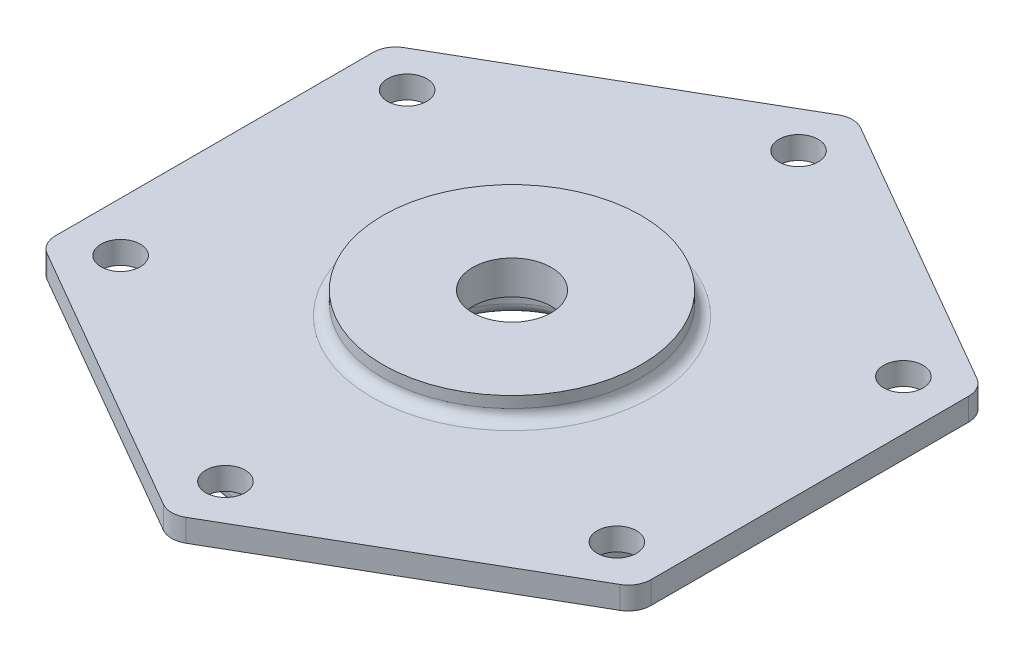
ISO-10303-21;
HEADER;
FILE_DESCRIPTION(('STEP AP214'),'2;1');
FILE_NAME('part.step','',(''),(''),'','','');
FILE_SCHEMA(('AUTOMOTIVE_DESIGN { 1 0 10303 214 1 1 1 1 }'));
ENDSEC;
DATA;
#1=APPLICATION_CONTEXT('core data for automotive mechanical design processes');
#2=APPLICATION_PROTOCOL_DEFINITION('international standard','automotive_design',2000,#1);
#3=PRODUCT_CONTEXT('',#1,'mechanical');
#4=PRODUCT('Part','Part','',(#3));
#5=PRODUCT_RELATED_PRODUCT_CATEGORY('part','',(#4));
#6=PRODUCT_DEFINITION_FORMATION('','',#4);
#7=PRODUCT_DEFINITION_CONTEXT('part definition',#1,'design');
#8=PRODUCT_DEFINITION('design','',#6,#7);
#9=PRODUCT_DEFINITION_SHAPE('','',#8);
#10=(LENGTH_UNIT() NAMED_UNIT(*) SI_UNIT(.MILLI.,.METRE.));
#11=(NAMED_UNIT(*) PLANE_ANGLE_UNIT() SI_UNIT($,.RADIAN.));
#12=(NAMED_UNIT(*) SI_UNIT($,.STERADIAN.) SOLID_ANGLE_UNIT());
#13=UNCERTAINTY_MEASURE_WITH_UNIT(LENGTH_MEASURE(1.E-05),#10,'distance_accuracy_value','');
#14=(GEOMETRIC_REPRESENTATION_CONTEXT(3) GLOBAL_UNCERTAINTY_ASSIGNED_CONTEXT((#13)) GLOBAL_UNIT_ASSIGNED_CONTEXT((#10,
#11,#12)) REPRESENTATION_CONTEXT('',''));
#15=CARTESIAN_POINT('',(0.,0.,0.));
#16=DIRECTION('',(0.,0.,1.));
#17=DIRECTION('',(1.,0.,0.));
#18=AXIS2_PLACEMENT_3D('',#15,#16,#17);
#19=CARTESIAN_POINT('',(-48.9999999999997,4.,28.2901631902923));
#20=DIRECTION('',(0.,-1.,0.));
#21=DIRECTION('',(0.,0.,-1.));
#22=AXIS2_PLACEMENT_3D('',#19,#20,#21);
#23=CYLINDRICAL_SURFACE('',#22,4.);
#24=CARTESIAN_POINT('',(-48.9999999999997,0.,28.2901631902923));
#25=DIRECTION('',(0.,1.,0.));
#26=DIRECTION('',(0.,0.,1.));
#27=AXIS2_PLACEMENT_3D('',#24,#25,#26);
#28=CIRCLE('',#27,4.);
#29=CARTESIAN_POINT('',(-52.9999999999997,0.,28.2901631902923));
#30=VERTEX_POINT('',#29);
#31=CARTESIAN_POINT('',(-50.9999999999997,0.,31.75426480543));
#32=VERTEX_POINT('',#31);
#33=EDGE_CURVE('E157',#30,#32,#28,.T.);
#34=ORIENTED_EDGE('',*,*,#33,.T.);
#35=DIRECTION('',(0.,-1.,0.));
#36=VECTOR('',#35,1.);
#37=CARTESIAN_POINT('',(-50.9999999999997,4.,31.75426480543));
#38=LINE('',#37,#36);
#39=CARTESIAN_POINT('',(-50.9999999999997,4.,31.75426480543));
#40=VERTEX_POINT('',#39);
#41=EDGE_CURVE('E205',#40,#32,#38,.T.);
#42=ORIENTED_EDGE('',*,*,#41,.F.);
#43=CARTESIAN_POINT('',(-48.9999999999997,4.,28.2901631902923));
#44=DIRECTION('',(0.,1.,0.));
#45=DIRECTION('',(0.,0.,1.));
#46=AXIS2_PLACEMENT_3D('',#43,#44,#45);
#47=CIRCLE('',#46,4.);
#48=CARTESIAN_POINT('',(-52.9999999999997,4.,28.2901631902923));
#49=VERTEX_POINT('',#48);
#50=EDGE_CURVE('E180',#49,#40,#47,.T.);
#51=ORIENTED_EDGE('',*,*,#50,.F.);
#52=DIRECTION('',(0.,-1.,0.));
#53=VECTOR('',#52,1.);
#54=CARTESIAN_POINT('',(-52.9999999999997,4.,28.2901631902923));
#55=LINE('',#54,#53);
#56=EDGE_CURVE('E153',#49,#30,#55,.T.);
#57=ORIENTED_EDGE('',*,*,#56,.T.);
#58=EDGE_LOOP('',(#34,#42,#51,#57));
#59=FACE_BOUND('',#58,.T.);
#60=ADVANCED_FACE('F33',(#59),#23,.T.);
#61=CARTESIAN_POINT('',(-50.9999999999997,4.,31.75426480543));
#62=DIRECTION('',(0.499999999999995,0.,-0.866025403784442));
#63=DIRECTION('',(-0.866025403784442,0.,-0.499999999999995));
#64=AXIS2_PLACEMENT_3D('',#61,#62,#63);
#65=PLANE('',#64);
#66=DIRECTION('',(0.866025403784441,0.,0.499999999999995));
#67=VECTOR('',#66,1.);
#68=CARTESIAN_POINT('',(-50.9999999999997,0.,31.75426480543));
#69=LINE('',#68,#67);
#70=CARTESIAN_POINT('',(-2.00000000000001,0.,60.0444279957211));
#71=VERTEX_POINT('',#70);
#72=EDGE_CURVE('E160',#32,#71,#69,.T.);
#73=ORIENTED_EDGE('',*,*,#72,.T.);
#74=DIRECTION('',(0.,-1.,0.));
#75=VECTOR('',#74,1.);
#76=CARTESIAN_POINT('',(-2.00000000000001,4.,60.0444279957211));
#77=LINE('',#76,#75);
#78=CARTESIAN_POINT('',(-2.00000000000001,4.,60.0444279957211));
#79=VERTEX_POINT('',#78);
#80=EDGE_CURVE('E202',#79,#71,#77,.T.);
#81=ORIENTED_EDGE('',*,*,#80,.F.);
#82=DIRECTION('',(0.866025403784441,0.,0.499999999999995));
#83=VECTOR('',#82,1.);
#84=CARTESIAN_POINT('',(-50.9999999999997,4.,31.75426480543));
#85=LINE('',#84,#83);
#86=EDGE_CURVE('E108',#40,#79,#85,.T.);
#87=ORIENTED_EDGE('',*,*,#86,.F.);
#88=ORIENTED_EDGE('',*,*,#41,.T.);
#89=EDGE_LOOP('',(#73,#81,#87,#88));
#90=FACE_BOUND('',#89,.T.);
#91=ADVANCED_FACE('F318',(#90),#65,.F.);
#92=CARTESIAN_POINT('',(0.,4.,56.5803263805834));
#93=DIRECTION('',(0.,-1.,0.));
#94=DIRECTION('',(0.,0.,-1.));
#95=AXIS2_PLACEMENT_3D('',#92,#93,#94);
#96=CYLINDRICAL_SURFACE('',#95,4.);
#97=CARTESIAN_POINT('',(0.,0.,56.5803263805834));
#98=DIRECTION('',(0.,1.,0.));
#99=DIRECTION('',(0.,0.,-1.));
#100=AXIS2_PLACEMENT_3D('',#97,#98,#99);
#101=CIRCLE('',#100,4.);
#102=CARTESIAN_POINT('',(2.,0.,60.0444279957211));
#103=VERTEX_POINT('',#102);
#104=EDGE_CURVE('E163',#71,#103,#101,.T.);
#105=ORIENTED_EDGE('',*,*,#104,.T.);
#106=DIRECTION('',(0.,-1.,0.));
#107=VECTOR('',#106,1.);
#108=CARTESIAN_POINT('',(2.,4.,60.0444279957211));
#109=LINE('',#108,#107);
#110=CARTESIAN_POINT('',(2.,4.,60.0444279957211));
#111=VERTEX_POINT('',#110);
#112=EDGE_CURVE('E199',#111,#103,#109,.T.);
#113=ORIENTED_EDGE('',*,*,#112,.F.);
#114=CARTESIAN_POINT('',(0.,4.,56.5803263805834));
#115=DIRECTION('',(0.,1.,0.));
#116=DIRECTION('',(0.,0.,-1.));
#117=AXIS2_PLACEMENT_3D('',#114,#115,#116);
#118=CIRCLE('',#117,4.);
#119=EDGE_CURVE('E278',#79,#111,#118,.T.);
#120=ORIENTED_EDGE('',*,*,#119,.F.);
#121=ORIENTED_EDGE('',*,*,#80,.T.);
#122=EDGE_LOOP('',(#105,#113,#120,#121));
#123=FACE_BOUND('',#122,.T.);
#124=ADVANCED_FACE('F323',(#123),#96,.T.);
#125=CARTESIAN_POINT('',(2.,4.,60.0444279957211));
#126=DIRECTION('',(-0.500000000000001,0.,-0.866025403784438));
#127=DIRECTION('',(-0.866025403784438,0.,0.500000000000001));
#128=AXIS2_PLACEMENT_3D('',#125,#126,#127);
#129=PLANE('',#128);
#130=DIRECTION('',(0.866025403784438,0.,-0.500000000000001));
#131=VECTOR('',#130,1.);
#132=CARTESIAN_POINT('',(2.,0.,60.0444279957211));
#133=LINE('',#132,#131);
#134=CARTESIAN_POINT('',(51.0000000000001,0.,31.7542648054293));
#135=VERTEX_POINT('',#134);
#136=EDGE_CURVE('E165',#103,#135,#133,.T.);
#137=ORIENTED_EDGE('',*,*,#136,.T.);
#138=DIRECTION('',(0.,-1.,0.));
#139=VECTOR('',#138,1.);
#140=CARTESIAN_POINT('',(51.0000000000001,4.,31.7542648054293));
#141=LINE('',#140,#139);
#142=CARTESIAN_POINT('',(51.0000000000001,4.,31.7542648054293));
#143=VERTEX_POINT('',#142);
#144=EDGE_CURVE('E196',#143,#135,#141,.T.);
#145=ORIENTED_EDGE('',*,*,#144,.F.);
#146=DIRECTION('',(0.866025403784438,0.,-0.500000000000001));
#147=VECTOR('',#146,1.);
#148=CARTESIAN_POINT('',(2.,4.,60.0444279957211));
#149=LINE('',#148,#147);
#150=EDGE_CURVE('E280',#111,#143,#149,.T.);
#151=ORIENTED_EDGE('',*,*,#150,.F.);
#152=ORIENTED_EDGE('',*,*,#112,.T.);
#153=EDGE_LOOP('',(#137,#145,#151,#152));
#154=FACE_BOUND('',#153,.T.);
#155=ADVANCED_FACE('F670',(#154),#129,.F.);
#156=CARTESIAN_POINT('',(49.0000000000001,4.,28.2901631902916));
#157=DIRECTION('',(0.,-1.,0.));
#158=DIRECTION('',(0.,0.,-1.));
#159=AXIS2_PLACEMENT_3D('',#156,#157,#158);
#160=CYLINDRICAL_SURFACE('',#159,4.);
#161=CARTESIAN_POINT('',(49.0000000000001,0.,28.2901631902916));
#162=DIRECTION('',(0.,1.,0.));
#163=DIRECTION('',(0.,0.,1.));
#164=AXIS2_PLACEMENT_3D('',#161,#162,#163);
#165=CIRCLE('',#164,4.);
#166=CARTESIAN_POINT('',(53.0000000000001,0.,28.2901631902915));
#167=VERTEX_POINT('',#166);
#168=EDGE_CURVE('E167',#135,#167,#165,.T.);
#169=ORIENTED_EDGE('',*,*,#168,.T.);
#170=DIRECTION('',(0.,-1.,0.));
#171=VECTOR('',#170,1.);
#172=CARTESIAN_POINT('',(53.0000000000001,4.,28.2901631902915));
#173=LINE('',#172,#171);
#174=CARTESIAN_POINT('',(53.0000000000001,4.,28.2901631902915));
#175=VERTEX_POINT('',#174);
#176=EDGE_CURVE('E193',#175,#167,#173,.T.);
#177=ORIENTED_EDGE('',*,*,#176,.F.);
#178=CARTESIAN_POINT('',(49.0000000000001,4.,28.2901631902916));
#179=DIRECTION('',(0.,1.,0.));
#180=DIRECTION('',(0.,0.,1.));
#181=AXIS2_PLACEMENT_3D('',#178,#179,#180);
#182=CIRCLE('',#181,4.);
#183=EDGE_CURVE('E282',#143,#175,#182,.T.);
#184=ORIENTED_EDGE('',*,*,#183,.F.);
#185=ORIENTED_EDGE('',*,*,#144,.T.);
#186=EDGE_LOOP('',(#169,#177,#184,#185));
#187=FACE_BOUND('',#186,.T.);
#188=ADVANCED_FACE('F660',(#187),#160,.T.);
#189=CARTESIAN_POINT('',(53.0000000000001,4.,28.2901631902915));
#190=DIRECTION('',(-1.,0.,0.));
#191=DIRECTION('',(0.,0.,1.));
#192=AXIS2_PLACEMENT_3D('',#189,#190,#191);
#193=PLANE('',#192);
#194=DIRECTION('',(0.,0.,-1.));
#195=VECTOR('',#194,1.);
#196=CARTESIAN_POINT('',(53.0000000000001,0.,28.2901631902915));
#197=LINE('',#196,#195);
#198=CARTESIAN_POINT('',(52.9999999999999,0.,-28.2901631902919));
#199=VERTEX_POINT('',#198);
#200=EDGE_CURVE('E169',#167,#199,#197,.T.);
#201=ORIENTED_EDGE('',*,*,#200,.T.);
#202=DIRECTION('',(0.,-1.,0.));
#203=VECTOR('',#202,1.);
#204=CARTESIAN_POINT('',(52.9999999999999,4.,-28.2901631902919));
#205=LINE('',#204,#203);
#206=CARTESIAN_POINT('',(52.9999999999999,4.,-28.2901631902919));
#207=VERTEX_POINT('',#206);
#208=EDGE_CURVE('E190',#207,#199,#205,.T.);
#209=ORIENTED_EDGE('',*,*,#208,.F.);
#210=DIRECTION('',(0.,0.,-1.));
#211=VECTOR('',#210,1.);
#212=CARTESIAN_POINT('',(53.0000000000001,4.,28.2901631902915));
#213=LINE('',#212,#211);
#214=EDGE_CURVE('E284',#175,#207,#213,.T.);
#215=ORIENTED_EDGE('',*,*,#214,.F.);
#216=ORIENTED_EDGE('',*,*,#176,.T.);
#217=EDGE_LOOP('',(#201,#209,#215,#216));
#218=FACE_BOUND('',#217,.T.);
#219=ADVANCED_FACE('F650',(#218),#193,.F.);
#220=CARTESIAN_POINT('',(48.9999999999999,4.,-28.2901631902919));
#221=DIRECTION('',(0.,-1.,0.));
#222=DIRECTION('',(0.,0.,-1.));
#223=AXIS2_PLACEMENT_3D('',#220,#221,#222);
#224=CYLINDRICAL_SURFACE('',#223,4.);
#225=CARTESIAN_POINT('',(48.9999999999999,0.,-28.2901631902919));
#226=DIRECTION('',(0.,1.,0.));
#227=DIRECTION('',(0.,0.,1.));
#228=AXIS2_PLACEMENT_3D('',#225,#226,#227);
#229=CIRCLE('',#228,4.);
#230=CARTESIAN_POINT('',(50.9999999999999,0.,-31.7542648054297));
#231=VERTEX_POINT('',#230);
#232=EDGE_CURVE('E171',#199,#231,#229,.T.);
#233=ORIENTED_EDGE('',*,*,#232,.T.);
#234=DIRECTION('',(0.,-1.,0.));
#235=VECTOR('',#234,1.);
#236=CARTESIAN_POINT('',(50.9999999999999,4.,-31.7542648054297));
#237=LINE('',#236,#235);
#238=CARTESIAN_POINT('',(50.9999999999999,4.,-31.7542648054297));
#239=VERTEX_POINT('',#238);
#240=EDGE_CURVE('E187',#239,#231,#237,.T.);
#241=ORIENTED_EDGE('',*,*,#240,.F.);
#242=CARTESIAN_POINT('',(48.9999999999999,4.,-28.2901631902919));
#243=DIRECTION('',(0.,1.,0.));
#244=DIRECTION('',(0.,0.,1.));
#245=AXIS2_PLACEMENT_3D('',#242,#243,#244);
#246=CIRCLE('',#245,4.);
#247=EDGE_CURVE('E286',#207,#239,#246,.T.);
#248=ORIENTED_EDGE('',*,*,#247,.F.);
#249=ORIENTED_EDGE('',*,*,#208,.T.);
#250=EDGE_LOOP('',(#233,#241,#248,#249));
#251=FACE_BOUND('',#250,.T.);
#252=ADVANCED_FACE('F641',(#251),#224,.T.);
#253=CARTESIAN_POINT('',(50.9999999999999,4.,-31.7542648054297));
#254=DIRECTION('',(-0.499999999999995,0.,0.866025403784442));
#255=DIRECTION('',(0.866025403784442,0.,0.499999999999995));
#256=AXIS2_PLACEMENT_3D('',#253,#254,#255);
#257=PLANE('',#256);
#258=DIRECTION('',(-0.866025403784442,0.,-0.499999999999995));
#259=VECTOR('',#258,1.);
#260=CARTESIAN_POINT('',(50.9999999999999,0.,-31.7542648054297));
#261=LINE('',#260,#259);
#262=CARTESIAN_POINT('',(1.9999999999996,0.,-60.0444279957211));
#263=VERTEX_POINT('',#262);
#264=EDGE_CURVE('E173',#231,#263,#261,.T.);
#265=ORIENTED_EDGE('',*,*,#264,.T.);
#266=DIRECTION('',(0.,-1.,0.));
#267=VECTOR('',#266,1.);
#268=CARTESIAN_POINT('',(1.9999999999996,4.,-60.0444279957211));
#269=LINE('',#268,#267);
#270=CARTESIAN_POINT('',(1.9999999999996,4.,-60.0444279957211));
#271=VERTEX_POINT('',#270);
#272=EDGE_CURVE('E184',#271,#263,#269,.T.);
#273=ORIENTED_EDGE('',*,*,#272,.F.);
#274=DIRECTION('',(-0.866025403784442,0.,-0.499999999999995));
#275=VECTOR('',#274,1.);
#276=CARTESIAN_POINT('',(50.9999999999999,4.,-31.7542648054297));
#277=LINE('',#276,#275);
#278=EDGE_CURVE('E288',#239,#271,#277,.T.);
#279=ORIENTED_EDGE('',*,*,#278,.F.);
#280=ORIENTED_EDGE('',*,*,#240,.T.);
#281=EDGE_LOOP('',(#265,#273,#279,#280));
#282=FACE_BOUND('',#281,.T.);
#283=ADVANCED_FACE('F294',(#282),#257,.F.);
#284=CARTESIAN_POINT('',(-3.95045457329304E-13,4.,-56.5803263805834));
#285=DIRECTION('',(0.,-1.,0.));
#286=DIRECTION('',(0.,0.,-1.));
#287=AXIS2_PLACEMENT_3D('',#284,#285,#286);
#288=CYLINDRICAL_SURFACE('',#287,4.);
#289=CARTESIAN_POINT('',(-3.95045457329304E-13,0.,-56.5803263805834));
#290=DIRECTION('',(0.,1.,0.));
#291=DIRECTION('',(0.,0.,1.));
#292=AXIS2_PLACEMENT_3D('',#289,#290,#291);
#293=CIRCLE('',#292,4.);
#294=CARTESIAN_POINT('',(-2.00000000000044,0.,-60.0444279957211));
#295=VERTEX_POINT('',#294);
#296=EDGE_CURVE('E175',#263,#295,#293,.T.);
#297=ORIENTED_EDGE('',*,*,#296,.T.);
#298=DIRECTION('',(0.,-1.,0.));
#299=VECTOR('',#298,1.);
#300=CARTESIAN_POINT('',(-2.00000000000044,4.,-60.0444279957211));
#301=LINE('',#300,#299);
#302=CARTESIAN_POINT('',(-2.00000000000044,4.,-60.0444279957211));
#303=VERTEX_POINT('',#302);
#304=EDGE_CURVE('E148',#303,#295,#301,.T.);
#305=ORIENTED_EDGE('',*,*,#304,.F.);
#306=CARTESIAN_POINT('',(-3.95045457329304E-13,4.,-56.5803263805834));
#307=DIRECTION('',(0.,1.,0.));
#308=DIRECTION('',(0.,0.,1.));
#309=AXIS2_PLACEMENT_3D('',#306,#307,#308);
#310=CIRCLE('',#309,4.);
#311=EDGE_CURVE('E139',#271,#303,#310,.T.);
#312=ORIENTED_EDGE('',*,*,#311,.F.);
#313=ORIENTED_EDGE('',*,*,#272,.T.);
#314=EDGE_LOOP('',(#297,#305,#312,#313));
#315=FACE_BOUND('',#314,.T.);
#316=ADVANCED_FACE('F298',(#315),#288,.T.);
#317=CARTESIAN_POINT('',(-2.00000000000044,4.,-60.0444279957211));
#318=DIRECTION('',(0.500000000000007,0.,0.866025403784435));
#319=DIRECTION('',(0.866025403784435,0.,-0.500000000000007));
#320=AXIS2_PLACEMENT_3D('',#317,#318,#319);
#321=PLANE('',#320);
#322=DIRECTION('',(-0.866025403784435,0.,0.500000000000007));
#323=VECTOR('',#322,1.);
#324=CARTESIAN_POINT('',(-2.00000000000044,0.,-60.0444279957211));
#325=LINE('',#324,#323);
#326=CARTESIAN_POINT('',(-51.0000000000003,0.,-31.754264805429));
#327=VERTEX_POINT('',#326);
#328=EDGE_CURVE('E147',#295,#327,#325,.T.);
#329=ORIENTED_EDGE('',*,*,#328,.T.);
#330=DIRECTION('',(0.,-1.,0.));
#331=VECTOR('',#330,1.);
#332=CARTESIAN_POINT('',(-51.0000000000003,4.,-31.754264805429));
#333=LINE('',#332,#331);
#334=CARTESIAN_POINT('',(-51.0000000000003,4.,-31.754264805429));
#335=VERTEX_POINT('',#334);
#336=EDGE_CURVE('E144',#335,#327,#333,.T.);
#337=ORIENTED_EDGE('',*,*,#336,.F.);
#338=DIRECTION('',(-0.866025403784435,0.,0.500000000000007));
#339=VECTOR('',#338,1.);
#340=CARTESIAN_POINT('',(-2.00000000000044,4.,-60.0444279957211));
#341=LINE('',#340,#339);
#342=EDGE_CURVE('E133',#303,#335,#341,.T.);
#343=ORIENTED_EDGE('',*,*,#342,.F.);
#344=ORIENTED_EDGE('',*,*,#304,.T.);
#345=EDGE_LOOP('',(#329,#337,#343,#344));
#346=FACE_BOUND('',#345,.T.);
#347=ADVANCED_FACE('F145',(#346),#321,.F.);
#348=CARTESIAN_POINT('',(-49.0000000000003,4.,-28.2901631902912));
#349=DIRECTION('',(0.,-1.,0.));
#350=DIRECTION('',(0.,0.,-1.));
#351=AXIS2_PLACEMENT_3D('',#348,#349,#350);
#352=CYLINDRICAL_SURFACE('',#351,4.);
#353=CARTESIAN_POINT('',(-49.0000000000003,0.,-28.2901631902912));
#354=DIRECTION('',(0.,1.,0.));
#355=DIRECTION('',(0.,0.,1.));
#356=AXIS2_PLACEMENT_3D('',#353,#354,#355);
#357=CIRCLE('',#356,4.);
#358=CARTESIAN_POINT('',(-53.0000000000003,0.,-28.2901631902912));
#359=VERTEX_POINT('',#358);
#360=EDGE_CURVE('E93',#327,#359,#357,.T.);
#361=ORIENTED_EDGE('',*,*,#360,.T.);
#362=DIRECTION('',(0.,-1.,0.));
#363=VECTOR('',#362,1.);
#364=CARTESIAN_POINT('',(-53.0000000000003,4.,-28.2901631902912));
#365=LINE('',#364,#363);
#366=CARTESIAN_POINT('',(-53.0000000000003,4.,-28.2901631902912));
#367=VERTEX_POINT('',#366);
#368=EDGE_CURVE('E149',#367,#359,#365,.T.);
#369=ORIENTED_EDGE('',*,*,#368,.F.);
#370=CARTESIAN_POINT('',(-49.0000000000003,4.,-28.2901631902912));
#371=DIRECTION('',(0.,1.,0.));
#372=DIRECTION('',(0.,0.,1.));
#373=AXIS2_PLACEMENT_3D('',#370,#371,#372);
#374=CIRCLE('',#373,4.);
#375=EDGE_CURVE('E137',#335,#367,#374,.T.);
#376=ORIENTED_EDGE('',*,*,#375,.F.);
#377=ORIENTED_EDGE('',*,*,#336,.T.);
#378=EDGE_LOOP('',(#361,#369,#376,#377));
#379=FACE_BOUND('',#378,.T.);
#380=ADVANCED_FACE('F151',(#379),#352,.T.);
#381=CARTESIAN_POINT('',(-53.0000000000003,4.,-28.2901631902912));
#382=DIRECTION('',(1.,0.,0.));
#383=DIRECTION('',(0.,0.,-1.));
#384=AXIS2_PLACEMENT_3D('',#381,#382,#383);
#385=PLANE('',#384);
#386=DIRECTION('',(0.,0.,1.));
#387=VECTOR('',#386,1.);
#388=CARTESIAN_POINT('',(-53.0000000000003,0.,-28.2901631902912));
#389=LINE('',#388,#387);
#390=EDGE_CURVE('E99',#359,#30,#389,.T.);
#391=ORIENTED_EDGE('',*,*,#390,.T.);
#392=ORIENTED_EDGE('',*,*,#56,.F.);
#393=DIRECTION('',(0.,0.,1.));
#394=VECTOR('',#393,1.);
#395=CARTESIAN_POINT('',(-53.0000000000003,4.,-28.2901631902912));
#396=LINE('',#395,#394);
#397=EDGE_CURVE('E52',#367,#49,#396,.T.);
#398=ORIENTED_EDGE('',*,*,#397,.F.);
#399=ORIENTED_EDGE('',*,*,#368,.T.);
#400=EDGE_LOOP('',(#391,#392,#398,#399));
#401=FACE_BOUND('',#400,.T.);
#402=ADVANCED_FACE('F306',(#401),#385,.F.);
#403=CARTESIAN_POINT('',(-48.9999999999997,4.,28.2901631902923));
#404=DIRECTION('',(0.,1.,0.));
#405=DIRECTION('',(0.,0.,1.));
#406=AXIS2_PLACEMENT_3D('',#403,#404,#405);
#407=PLANE('',#406);
#408=CARTESIAN_POINT('',(0.,4.,-51.));
#409=DIRECTION('',(0.,1.,0.));
#410=DIRECTION('',(0.,0.,1.));
#411=AXIS2_PLACEMENT_3D('',#408,#409,#410);
#412=CIRCLE('',#411,3.5);
#413=CARTESIAN_POINT('',(0.,4.,-47.5));
#414=VERTEX_POINT('',#413);
#415=EDGE_CURVE('E238',#414,#414,#412,.T.);
#416=ORIENTED_EDGE('',*,*,#415,.F.);
#417=EDGE_LOOP('',(#416));
#418=FACE_BOUND('',#417,.T.);
#419=CARTESIAN_POINT('',(-44.1672955930053,4.,-25.4999999999981));
#420=DIRECTION('',(0.,1.,0.));
#421=DIRECTION('',(0.,0.,1.));
#422=AXIS2_PLACEMENT_3D('',#419,#420,#421);
#423=CIRCLE('',#422,3.50000000000219);
#424=CARTESIAN_POINT('',(-44.1672955930053,4.,-21.9999999999959));
#425=VERTEX_POINT('',#424);
#426=EDGE_CURVE('E442',#425,#425,#423,.T.);
#427=ORIENTED_EDGE('',*,*,#426,.F.);
#428=EDGE_LOOP('',(#427));
#429=FACE_BOUND('',#428,.T.);
#430=CARTESIAN_POINT('',(-44.1672955930031,4.,25.5000000000019));
#431=DIRECTION('',(0.,1.,0.));
#432=DIRECTION('',(0.,0.,1.));
#433=AXIS2_PLACEMENT_3D('',#430,#431,#432);
#434=CIRCLE('',#433,3.50000000000413);
#435=CARTESIAN_POINT('',(-44.1672955930031,4.,29.000000000006));
#436=VERTEX_POINT('',#435);
#437=EDGE_CURVE('E439',#436,#436,#434,.T.);
#438=ORIENTED_EDGE('',*,*,#437,.F.);
#439=EDGE_LOOP('',(#438));
#440=FACE_BOUND('',#439,.T.);
#441=CARTESIAN_POINT('',(4.32978444682486E-12,4.,51.));
#442=DIRECTION('',(0.,1.,0.));
#443=DIRECTION('',(0.,0.,1.));
#444=AXIS2_PLACEMENT_3D('',#441,#442,#443);
#445=CIRCLE('',#444,3.50000000000448);
#446=CARTESIAN_POINT('',(4.32978444682486E-12,4.,54.5000000000045));
#447=VERTEX_POINT('',#446);
#448=EDGE_CURVE('E441',#447,#447,#445,.T.);
#449=ORIENTED_EDGE('',*,*,#448,.F.);
#450=EDGE_LOOP('',(#449));
#451=FACE_BOUND('',#450,.T.);
#452=CARTESIAN_POINT('',(44.1672955930096,4.,25.4999999999981));
#453=DIRECTION('',(0.,1.,0.));
#454=DIRECTION('',(0.,0.,1.));
#455=AXIS2_PLACEMENT_3D('',#452,#453,#454);
#456=CIRCLE('',#455,3.50000000000279);
#457=CARTESIAN_POINT('',(44.1672955930096,4.,29.0000000000009));
#458=VERTEX_POINT('',#457);
#459=EDGE_CURVE('E444',#458,#458,#456,.T.);
#460=ORIENTED_EDGE('',*,*,#459,.F.);
#461=EDGE_LOOP('',(#460));
#462=FACE_BOUND('',#461,.T.);
#463=CARTESIAN_POINT('',(44.1672955930074,4.,-25.5000000000019));
#464=DIRECTION('',(0.,1.,0.));
#465=DIRECTION('',(0.,0.,1.));
#466=AXIS2_PLACEMENT_3D('',#463,#464,#465);
#467=CIRCLE('',#466,3.50000000000063);
#468=CARTESIAN_POINT('',(44.1672955930074,4.,-22.0000000000013));
#469=VERTEX_POINT('',#468);
#470=EDGE_CURVE('E451',#469,#469,#467,.T.);
#471=ORIENTED_EDGE('',*,*,#470,.F.);
#472=EDGE_LOOP('',(#471));
#473=FACE_BOUND('',#472,.T.);
#474=CARTESIAN_POINT('',(0.,4.,0.));
#475=DIRECTION('',(0.,1.,0.));
#476=DIRECTION('',(0.,0.,1.));
#477=AXIS2_PLACEMENT_3D('',#474,#475,#476);
#478=CIRCLE('',#477,25.);
#479=CARTESIAN_POINT('',(0.,4.,25.));
#480=VERTEX_POINT('',#479);
#481=EDGE_CURVE('E11',#480,#480,#478,.F.);
#482=ORIENTED_EDGE('',*,*,#481,.T.);
#483=EDGE_LOOP('',(#482));
#484=FACE_BOUND('',#483,.T.);
#485=ORIENTED_EDGE('',*,*,#50,.T.);
#486=ORIENTED_EDGE('',*,*,#86,.T.);
#487=ORIENTED_EDGE('',*,*,#119,.T.);
#488=ORIENTED_EDGE('',*,*,#150,.T.);
#489=ORIENTED_EDGE('',*,*,#183,.T.);
#490=ORIENTED_EDGE('',*,*,#214,.T.);
#491=ORIENTED_EDGE('',*,*,#247,.T.);
#492=ORIENTED_EDGE('',*,*,#278,.T.);
#493=ORIENTED_EDGE('',*,*,#311,.T.);
#494=ORIENTED_EDGE('',*,*,#342,.T.);
#495=ORIENTED_EDGE('',*,*,#375,.T.);
#496=ORIENTED_EDGE('',*,*,#397,.T.);
#497=EDGE_LOOP('',(#485,#486,#487,#488,#489,#490,#491,#492,#493,#494,#495,#496));
#498=FACE_BOUND('',#497,.T.);
#499=ADVANCED_FACE('F135',(#418,#429,#440,#451,#462,#473,#484,#498),#407,.T.);
#500=CARTESIAN_POINT('',(-48.9999999999997,0.,28.2901631902923));
#501=DIRECTION('',(0.,1.,0.));
#502=DIRECTION('',(0.,0.,1.));
#503=AXIS2_PLACEMENT_3D('',#500,#501,#502);
#504=PLANE('',#503);
#505=CARTESIAN_POINT('',(0.,0.,-51.));
#506=DIRECTION('',(0.,1.,0.));
#507=DIRECTION('',(0.,0.,1.));
#508=AXIS2_PLACEMENT_3D('',#505,#506,#507);
#509=CIRCLE('',#508,3.5);
#510=CARTESIAN_POINT('',(0.,0.,-47.5));
#511=VERTEX_POINT('',#510);
#512=EDGE_CURVE('E37',#511,#511,#509,.T.);
#513=ORIENTED_EDGE('',*,*,#512,.T.);
#514=EDGE_LOOP('',(#513));
#515=FACE_BOUND('',#514,.T.);
#516=CARTESIAN_POINT('',(-44.1672955930053,0.,-25.4999999999981));
#517=DIRECTION('',(0.,1.,0.));
#518=DIRECTION('',(0.,0.,1.));
#519=AXIS2_PLACEMENT_3D('',#516,#517,#518);
#520=CIRCLE('',#519,3.50000000000219);
#521=CARTESIAN_POINT('',(-44.1672955930053,0.,-21.9999999999959));
#522=VERTEX_POINT('',#521);
#523=EDGE_CURVE('E246',#522,#522,#520,.T.);
#524=ORIENTED_EDGE('',*,*,#523,.T.);
#525=EDGE_LOOP('',(#524));
#526=FACE_BOUND('',#525,.T.);
#527=CARTESIAN_POINT('',(-44.1672955930031,0.,25.5000000000019));
#528=DIRECTION('',(0.,1.,0.));
#529=DIRECTION('',(0.,0.,1.));
#530=AXIS2_PLACEMENT_3D('',#527,#528,#529);
#531=CIRCLE('',#530,3.50000000000413);
#532=CARTESIAN_POINT('',(-44.1672955930031,0.,29.000000000006));
#533=VERTEX_POINT('',#532);
#534=EDGE_CURVE('E244',#533,#533,#531,.T.);
#535=ORIENTED_EDGE('',*,*,#534,.T.);
#536=EDGE_LOOP('',(#535));
#537=FACE_BOUND('',#536,.T.);
#538=CARTESIAN_POINT('',(4.32978444682486E-12,0.,51.));
#539=DIRECTION('',(0.,1.,0.));
#540=DIRECTION('',(0.,0.,1.));
#541=AXIS2_PLACEMENT_3D('',#538,#539,#540);
#542=CIRCLE('',#541,3.50000000000448);
#543=CARTESIAN_POINT('',(4.32978444682486E-12,0.,54.5000000000045));
#544=VERTEX_POINT('',#543);
#545=EDGE_CURVE('E241',#544,#544,#542,.T.);
#546=ORIENTED_EDGE('',*,*,#545,.T.);
#547=EDGE_LOOP('',(#546));
#548=FACE_BOUND('',#547,.T.);
#549=CARTESIAN_POINT('',(44.1672955930096,0.,25.4999999999981));
#550=DIRECTION('',(0.,1.,0.));
#551=DIRECTION('',(0.,0.,1.));
#552=AXIS2_PLACEMENT_3D('',#549,#550,#551);
#553=CIRCLE('',#552,3.50000000000279);
#554=CARTESIAN_POINT('',(44.1672955930096,0.,29.0000000000009));
#555=VERTEX_POINT('',#554);
#556=EDGE_CURVE('E237',#555,#555,#553,.T.);
#557=ORIENTED_EDGE('',*,*,#556,.T.);
#558=EDGE_LOOP('',(#557));
#559=FACE_BOUND('',#558,.T.);
#560=CARTESIAN_POINT('',(44.1672955930074,0.,-25.5000000000019));
#561=DIRECTION('',(0.,1.,0.));
#562=DIRECTION('',(0.,0.,1.));
#563=AXIS2_PLACEMENT_3D('',#560,#561,#562);
#564=CIRCLE('',#563,3.50000000000063);
#565=CARTESIAN_POINT('',(44.1672955930074,0.,-22.0000000000013));
#566=VERTEX_POINT('',#565);
#567=EDGE_CURVE('E234',#566,#566,#564,.T.);
#568=ORIENTED_EDGE('',*,*,#567,.T.);
#569=EDGE_LOOP('',(#568));
#570=FACE_BOUND('',#569,.T.);
#571=CARTESIAN_POINT('',(0.,0.,0.));
#572=DIRECTION('',(0.,-1.,0.));
#573=DIRECTION('',(0.,0.,-1.));
#574=AXIS2_PLACEMENT_3D('',#571,#572,#573);
#575=CIRCLE('',#574,45.);
#576=CARTESIAN_POINT('',(0.,0.,-45.));
#577=VERTEX_POINT('',#576);
#578=EDGE_CURVE('E207',#577,#577,#575,.T.);
#579=ORIENTED_EDGE('',*,*,#578,.F.);
#580=EDGE_LOOP('',(#579));
#581=FACE_BOUND('',#580,.T.);
#582=ORIENTED_EDGE('',*,*,#33,.F.);
#583=ORIENTED_EDGE('',*,*,#390,.F.);
#584=ORIENTED_EDGE('',*,*,#360,.F.);
#585=ORIENTED_EDGE('',*,*,#328,.F.);
#586=ORIENTED_EDGE('',*,*,#296,.F.);
#587=ORIENTED_EDGE('',*,*,#264,.F.);
#588=ORIENTED_EDGE('',*,*,#232,.F.);
#589=ORIENTED_EDGE('',*,*,#200,.F.);
#590=ORIENTED_EDGE('',*,*,#168,.F.);
#591=ORIENTED_EDGE('',*,*,#136,.F.);
#592=ORIENTED_EDGE('',*,*,#104,.F.);
#593=ORIENTED_EDGE('',*,*,#72,.F.);
#594=EDGE_LOOP('',(#582,#583,#584,#585,#586,#587,#588,#589,#590,#591,#592,#593));
#595=FACE_BOUND('',#594,.T.);
#596=ADVANCED_FACE('F301',(#515,#526,#537,#548,#559,#570,#581,#595),#504,.F.);
#597=CARTESIAN_POINT('',(0.,8.,0.));
#598=DIRECTION('',(0.,-1.,0.));
#599=DIRECTION('',(0.,0.,-1.));
#600=AXIS2_PLACEMENT_3D('',#597,#598,#599);
#601=CYLINDRICAL_SURFACE('',#600,23.);
#602=CARTESIAN_POINT('',(0.,6.,0.));
#603=DIRECTION('',(0.,1.,0.));
#604=DIRECTION('',(0.,0.,1.));
#605=AXIS2_PLACEMENT_3D('',#602,#603,#604);
#606=CIRCLE('',#605,23.);
#607=CARTESIAN_POINT('',(0.,6.,23.));
#608=VERTEX_POINT('',#607);
#609=EDGE_CURVE('E43',#608,#608,#606,.T.);
#610=ORIENTED_EDGE('',*,*,#609,.T.);
#611=EDGE_LOOP('',(#610));
#612=FACE_BOUND('',#611,.T.);
#613=CARTESIAN_POINT('',(0.,8.,0.));
#614=DIRECTION('',(0.,1.,0.));
#615=DIRECTION('',(0.,0.,1.));
#616=AXIS2_PLACEMENT_3D('',#613,#614,#615);
#617=CIRCLE('',#616,23.);
#618=CARTESIAN_POINT('',(0.,8.,23.));
#619=VERTEX_POINT('',#618);
#620=EDGE_CURVE('E161',#619,#619,#617,.T.);
#621=ORIENTED_EDGE('',*,*,#620,.F.);
#622=EDGE_LOOP('',(#621));
#623=FACE_BOUND('',#622,.T.);
#624=ADVANCED_FACE('F392',(#612,#623),#601,.T.);
#625=CARTESIAN_POINT('',(0.,8.,0.));
#626=DIRECTION('',(0.,1.,0.));
#627=DIRECTION('',(0.,0.,1.));
#628=AXIS2_PLACEMENT_3D('',#625,#626,#627);
#629=PLANE('',#628);
#630=CARTESIAN_POINT('',(0.,8.,0.));
#631=DIRECTION('',(0.,-1.,0.));
#632=DIRECTION('',(0.,0.,-1.));
#633=AXIS2_PLACEMENT_3D('',#630,#631,#632);
#634=CIRCLE('',#633,7.);
#635=CARTESIAN_POINT('',(0.,8.,-7.));
#636=VERTEX_POINT('',#635);
#637=EDGE_CURVE('E255',#636,#636,#634,.T.);
#638=ORIENTED_EDGE('',*,*,#637,.T.);
#639=EDGE_LOOP('',(#638));
#640=FACE_BOUND('',#639,.T.);
#641=ORIENTED_EDGE('',*,*,#620,.T.);
#642=EDGE_LOOP('',(#641));
#643=FACE_BOUND('',#642,.T.);
#644=ADVANCED_FACE('F388',(#640,#643),#629,.T.);
#645=CARTESIAN_POINT('',(0.,-6.,0.));
#646=DIRECTION('',(0.,1.,0.));
#647=DIRECTION('',(0.,0.,1.));
#648=AXIS2_PLACEMENT_3D('',#645,#646,#647);
#649=CYLINDRICAL_SURFACE('',#648,45.);
#650=CARTESIAN_POINT('',(0.,-4.,0.));
#651=DIRECTION('',(0.,-1.,0.));
#652=DIRECTION('',(0.,0.,-1.));
#653=AXIS2_PLACEMENT_3D('',#650,#651,#652);
#654=CIRCLE('',#653,45.);
#655=CARTESIAN_POINT('',(0.,-4.,-45.));
#656=VERTEX_POINT('',#655);
#657=EDGE_CURVE('E214',#656,#656,#654,.F.);
#658=ORIENTED_EDGE('',*,*,#657,.T.);
#659=EDGE_LOOP('',(#658));
#660=FACE_BOUND('',#659,.T.);
#661=ORIENTED_EDGE('',*,*,#578,.T.);
#662=EDGE_LOOP('',(#661));
#663=FACE_BOUND('',#662,.T.);
#664=ADVANCED_FACE('F384',(#660,#663),#649,.T.);
#665=CARTESIAN_POINT('',(0.,-6.,0.));
#666=DIRECTION('',(0.,-1.,0.));
#667=DIRECTION('',(0.,0.,-1.));
#668=AXIS2_PLACEMENT_3D('',#665,#666,#667);
#669=PLANE('',#668);
#670=CARTESIAN_POINT('',(0.,-6.,0.));
#671=DIRECTION('',(0.,-1.,0.));
#672=DIRECTION('',(0.,0.,-1.));
#673=AXIS2_PLACEMENT_3D('',#670,#671,#672);
#674=CIRCLE('',#673,43.);
#675=CARTESIAN_POINT('',(0.,-6.,-43.));
#676=VERTEX_POINT('',#675);
#677=EDGE_CURVE('E211',#676,#676,#674,.T.);
#678=ORIENTED_EDGE('',*,*,#677,.T.);
#679=EDGE_LOOP('',(#678));
#680=FACE_BOUND('',#679,.T.);
#681=CARTESIAN_POINT('',(0.,-6.,0.));
#682=DIRECTION('',(0.,-1.,0.));
#683=DIRECTION('',(0.,0.,-1.));
#684=AXIS2_PLACEMENT_3D('',#681,#682,#683);
#685=CIRCLE('',#684,42.);
#686=CARTESIAN_POINT('',(0.,-6.,-42.));
#687=VERTEX_POINT('',#686);
#688=EDGE_CURVE('E208',#687,#687,#685,.F.);
#689=ORIENTED_EDGE('',*,*,#688,.T.);
#690=EDGE_LOOP('',(#689));
#691=FACE_BOUND('',#690,.T.);
#692=ADVANCED_FACE('F380',(#680,#691),#669,.T.);
#693=CARTESIAN_POINT('',(0.,0.,0.));
#694=DIRECTION('',(0.,-1.,0.));
#695=DIRECTION('',(0.,0.,-1.));
#696=AXIS2_PLACEMENT_3D('',#693,#694,#695);
#697=CYLINDRICAL_SURFACE('',#696,40.);
#698=CARTESIAN_POINT('',(0.,-4.,0.));
#699=DIRECTION('',(0.,-1.,0.));
#700=DIRECTION('',(0.,0.,-1.));
#701=AXIS2_PLACEMENT_3D('',#698,#699,#700);
#702=CIRCLE('',#701,40.);
#703=CARTESIAN_POINT('',(0.,-4.,-40.));
#704=VERTEX_POINT('',#703);
#705=EDGE_CURVE('E217',#704,#704,#702,.T.);
#706=ORIENTED_EDGE('',*,*,#705,.T.);
#707=EDGE_LOOP('',(#706));
#708=FACE_BOUND('',#707,.T.);
#709=CARTESIAN_POINT('',(0.,0.,0.));
#710=DIRECTION('',(0.,-1.,0.));
#711=DIRECTION('',(0.,0.,-1.));
#712=AXIS2_PLACEMENT_3D('',#709,#710,#711);
#713=CIRCLE('',#712,40.);
#714=CARTESIAN_POINT('',(0.,0.,-40.));
#715=VERTEX_POINT('',#714);
#716=EDGE_CURVE('E269',#715,#715,#713,.T.);
#717=ORIENTED_EDGE('',*,*,#716,.F.);
#718=EDGE_LOOP('',(#717));
#719=FACE_BOUND('',#718,.T.);
#720=ADVANCED_FACE('F376',(#708,#719),#697,.F.);
#721=CARTESIAN_POINT('',(0.,0.,0.));
#722=DIRECTION('',(0.,-1.,0.));
#723=DIRECTION('',(0.,0.,-1.));
#724=AXIS2_PLACEMENT_3D('',#721,#722,#723);
#725=PLANE('',#724);
#726=CARTESIAN_POINT('',(0.,0.,0.));
#727=DIRECTION('',(0.,-1.,0.));
#728=DIRECTION('',(0.,0.,-1.));
#729=AXIS2_PLACEMENT_3D('',#726,#727,#728);
#730=CIRCLE('',#729,19.);
#731=CARTESIAN_POINT('',(0.,0.,-19.));
#732=VERTEX_POINT('',#731);
#733=EDGE_CURVE('E266',#732,#732,#730,.T.);
#734=ORIENTED_EDGE('',*,*,#733,.F.);
#735=EDGE_LOOP('',(#734));
#736=FACE_BOUND('',#735,.T.);
#737=ORIENTED_EDGE('',*,*,#716,.T.);
#738=EDGE_LOOP('',(#737));
#739=FACE_BOUND('',#738,.T.);
#740=ADVANCED_FACE('F372',(#736,#739),#725,.T.);
#741=CARTESIAN_POINT('',(0.,0.,0.));
#742=DIRECTION('',(0.,-1.,0.));
#743=DIRECTION('',(0.,0.,-1.));
#744=AXIS2_PLACEMENT_3D('',#741,#742,#743);
#745=CYLINDRICAL_SURFACE('',#744,19.);
#746=CARTESIAN_POINT('',(0.,-4.,0.));
#747=DIRECTION('',(0.,-1.,0.));
#748=DIRECTION('',(0.,0.,-1.));
#749=AXIS2_PLACEMENT_3D('',#746,#747,#748);
#750=CIRCLE('',#749,19.);
#751=CARTESIAN_POINT('',(0.,-4.,-19.));
#752=VERTEX_POINT('',#751);
#753=EDGE_CURVE('E226',#752,#752,#750,.F.);
#754=ORIENTED_EDGE('',*,*,#753,.T.);
#755=EDGE_LOOP('',(#754));
#756=FACE_BOUND('',#755,.T.);
#757=ORIENTED_EDGE('',*,*,#733,.T.);
#758=EDGE_LOOP('',(#757));
#759=FACE_BOUND('',#758,.T.);
#760=ADVANCED_FACE('F369',(#756,#759),#745,.T.);
#761=CARTESIAN_POINT('',(0.,-6.,0.));
#762=DIRECTION('',(0.,-1.,0.));
#763=DIRECTION('',(0.,0.,-1.));
#764=AXIS2_PLACEMENT_3D('',#761,#762,#763);
#765=CIRCLE('',#764,17.);
#766=CARTESIAN_POINT('',(0.,-6.,-17.));
#767=VERTEX_POINT('',#766);
#768=EDGE_CURVE('E223',#767,#767,#765,.T.);
#769=ORIENTED_EDGE('',*,*,#768,.T.);
#770=EDGE_LOOP('',(#769));
#771=FACE_BOUND('',#770,.T.);
#772=CARTESIAN_POINT('',(0.,-6.,0.));
#773=DIRECTION('',(0.,-1.,0.));
#774=DIRECTION('',(0.,0.,-1.));
#775=AXIS2_PLACEMENT_3D('',#772,#773,#774);
#776=CIRCLE('',#775,16.);
#777=CARTESIAN_POINT('',(0.,-6.,-16.));
#778=VERTEX_POINT('',#777);
#779=EDGE_CURVE('E220',#778,#778,#776,.F.);
#780=ORIENTED_EDGE('',*,*,#779,.T.);
#781=EDGE_LOOP('',(#780));
#782=FACE_BOUND('',#781,.T.);
#783=ADVANCED_FACE('F355',(#771,#782),#669,.T.);
#784=CARTESIAN_POINT('',(0.,2.,0.));
#785=DIRECTION('',(0.,-1.,0.));
#786=DIRECTION('',(0.,0.,-1.));
#787=AXIS2_PLACEMENT_3D('',#784,#785,#786);
#788=CYLINDRICAL_SURFACE('',#787,14.);
#789=CARTESIAN_POINT('',(0.,-4.,0.));
#790=DIRECTION('',(0.,-1.,0.));
#791=DIRECTION('',(0.,0.,-1.));
#792=AXIS2_PLACEMENT_3D('',#789,#790,#791);
#793=CIRCLE('',#792,14.);
#794=CARTESIAN_POINT('',(0.,-4.,-14.));
#795=VERTEX_POINT('',#794);
#796=EDGE_CURVE('E229',#795,#795,#793,.T.);
#797=ORIENTED_EDGE('',*,*,#796,.T.);
#798=EDGE_LOOP('',(#797));
#799=FACE_BOUND('',#798,.T.);
#800=CARTESIAN_POINT('',(0.,2.,0.));
#801=DIRECTION('',(0.,-1.,0.));
#802=DIRECTION('',(0.,0.,-1.));
#803=AXIS2_PLACEMENT_3D('',#800,#801,#802);
#804=CIRCLE('',#803,14.);
#805=CARTESIAN_POINT('',(0.,2.,-14.));
#806=VERTEX_POINT('',#805);
#807=EDGE_CURVE('E260',#806,#806,#804,.T.);
#808=ORIENTED_EDGE('',*,*,#807,.F.);
#809=EDGE_LOOP('',(#808));
#810=FACE_BOUND('',#809,.T.);
#811=ADVANCED_FACE('F351',(#799,#810),#788,.F.);
#812=CARTESIAN_POINT('',(0.,2.,0.));
#813=DIRECTION('',(0.,-1.,0.));
#814=DIRECTION('',(0.,0.,-1.));
#815=AXIS2_PLACEMENT_3D('',#812,#813,#814);
#816=PLANE('',#815);
#817=CARTESIAN_POINT('',(0.,2.,0.));
#818=DIRECTION('',(0.,-1.,0.));
#819=DIRECTION('',(0.,0.,-1.));
#820=AXIS2_PLACEMENT_3D('',#817,#818,#819);
#821=CIRCLE('',#820,7.);
#822=CARTESIAN_POINT('',(0.,2.,-7.));
#823=VERTEX_POINT('',#822);
#824=EDGE_CURVE('E251',#823,#823,#821,.T.);
#825=ORIENTED_EDGE('',*,*,#824,.F.);
#826=EDGE_LOOP('',(#825));
#827=FACE_BOUND('',#826,.T.);
#828=ORIENTED_EDGE('',*,*,#807,.T.);
#829=EDGE_LOOP('',(#828));
#830=FACE_BOUND('',#829,.T.);
#831=ADVANCED_FACE('F354',(#827,#830),#816,.T.);
#832=CARTESIAN_POINT('',(0.,8.,0.));
#833=DIRECTION('',(0.,-1.,0.));
#834=DIRECTION('',(0.,0.,-1.));
#835=AXIS2_PLACEMENT_3D('',#832,#833,#834);
#836=CYLINDRICAL_SURFACE('',#835,7.);
#837=ORIENTED_EDGE('',*,*,#637,.F.);
#838=EDGE_LOOP('',(#837));
#839=FACE_BOUND('',#838,.T.);
#840=ORIENTED_EDGE('',*,*,#824,.T.);
#841=EDGE_LOOP('',(#840));
#842=FACE_BOUND('',#841,.T.);
#843=ADVANCED_FACE('F331',(#839,#842),#836,.F.);
#844=CARTESIAN_POINT('',(0.,-4.,0.));
#845=DIRECTION('',(0.,-1.,0.));
#846=DIRECTION('',(0.,0.,-1.));
#847=AXIS2_PLACEMENT_3D('',#844,#845,#846);
#848=TOROIDAL_SURFACE('',#847,43.,2.);
#849=ORIENTED_EDGE('',*,*,#657,.F.);
#850=EDGE_LOOP('',(#849));
#851=FACE_BOUND('',#850,.T.);
#852=ORIENTED_EDGE('',*,*,#677,.F.);
#853=EDGE_LOOP('',(#852));
#854=FACE_BOUND('',#853,.T.);
#855=ADVANCED_FACE('F327',(#851,#854),#848,.T.);
#856=CARTESIAN_POINT('',(0.,-4.,0.));
#857=DIRECTION('',(0.,-1.,0.));
#858=DIRECTION('',(0.,0.,-1.));
#859=AXIS2_PLACEMENT_3D('',#856,#857,#858);
#860=TOROIDAL_SURFACE('',#859,42.,2.);
#861=ORIENTED_EDGE('',*,*,#688,.F.);
#862=EDGE_LOOP('',(#861));
#863=FACE_BOUND('',#862,.T.);
#864=ORIENTED_EDGE('',*,*,#705,.F.);
#865=EDGE_LOOP('',(#864));
#866=FACE_BOUND('',#865,.T.);
#867=ADVANCED_FACE('F330',(#863,#866),#860,.T.);
#868=CARTESIAN_POINT('',(0.,-4.,0.));
#869=DIRECTION('',(0.,-1.,0.));
#870=DIRECTION('',(0.,0.,-1.));
#871=AXIS2_PLACEMENT_3D('',#868,#869,#870);
#872=TOROIDAL_SURFACE('',#871,17.,2.);
#873=ORIENTED_EDGE('',*,*,#753,.F.);
#874=EDGE_LOOP('',(#873));
#875=FACE_BOUND('',#874,.T.);
#876=ORIENTED_EDGE('',*,*,#768,.F.);
#877=EDGE_LOOP('',(#876));
#878=FACE_BOUND('',#877,.T.);
#879=ADVANCED_FACE('F335',(#875,#878),#872,.T.);
#880=CARTESIAN_POINT('',(0.,-4.,0.));
#881=DIRECTION('',(0.,-1.,0.));
#882=DIRECTION('',(0.,0.,-1.));
#883=AXIS2_PLACEMENT_3D('',#880,#881,#882);
#884=TOROIDAL_SURFACE('',#883,16.,2.);
#885=ORIENTED_EDGE('',*,*,#779,.F.);
#886=EDGE_LOOP('',(#885));
#887=FACE_BOUND('',#886,.T.);
#888=ORIENTED_EDGE('',*,*,#796,.F.);
#889=EDGE_LOOP('',(#888));
#890=FACE_BOUND('',#889,.T.);
#891=ADVANCED_FACE('F338',(#887,#890),#884,.T.);
#892=CARTESIAN_POINT('',(0.,6.,0.));
#893=DIRECTION('',(0.,1.,0.));
#894=DIRECTION('',(0.,0.,1.));
#895=AXIS2_PLACEMENT_3D('',#892,#893,#894);
#896=TOROIDAL_SURFACE('',#895,25.,2.);
#897=ORIENTED_EDGE('',*,*,#481,.F.);
#898=EDGE_LOOP('',(#897));
#899=FACE_BOUND('',#898,.T.);
#900=ORIENTED_EDGE('',*,*,#609,.F.);
#901=EDGE_LOOP('',(#900));
#902=FACE_BOUND('',#901,.T.);
#903=ADVANCED_FACE('F35',(#899,#902),#896,.F.);
#904=CARTESIAN_POINT('',(44.1672955930074,-6.,-25.5000000000019));
#905=DIRECTION('',(0.,1.,0.));
#906=DIRECTION('',(0.,0.,1.));
#907=AXIS2_PLACEMENT_3D('',#904,#905,#906);
#908=CYLINDRICAL_SURFACE('',#907,3.50000000000063);
#909=ORIENTED_EDGE('',*,*,#470,.T.);
#910=EDGE_LOOP('',(#909));
#911=FACE_BOUND('',#910,.T.);
#912=ORIENTED_EDGE('',*,*,#567,.F.);
#913=EDGE_LOOP('',(#912));
#914=FACE_BOUND('',#913,.T.);
#915=ADVANCED_FACE('F345',(#911,#914),#908,.F.);
#916=CARTESIAN_POINT('',(44.1672955930096,-6.,25.4999999999981));
#917=DIRECTION('',(0.,1.,0.));
#918=DIRECTION('',(0.,0.,1.));
#919=AXIS2_PLACEMENT_3D('',#916,#917,#918);
#920=CYLINDRICAL_SURFACE('',#919,3.50000000000279);
#921=ORIENTED_EDGE('',*,*,#459,.T.);
#922=EDGE_LOOP('',(#921));
#923=FACE_BOUND('',#922,.T.);
#924=ORIENTED_EDGE('',*,*,#556,.F.);
#925=EDGE_LOOP('',(#924));
#926=FACE_BOUND('',#925,.T.);
#927=ADVANCED_FACE('F412',(#923,#926),#920,.F.);
#928=CARTESIAN_POINT('',(4.32978444682486E-12,-6.,51.));
#929=DIRECTION('',(0.,1.,0.));
#930=DIRECTION('',(0.,0.,1.));
#931=AXIS2_PLACEMENT_3D('',#928,#929,#930);
#932=CYLINDRICAL_SURFACE('',#931,3.50000000000448);
#933=ORIENTED_EDGE('',*,*,#448,.T.);
#934=EDGE_LOOP('',(#933));
#935=FACE_BOUND('',#934,.T.);
#936=ORIENTED_EDGE('',*,*,#545,.F.);
#937=EDGE_LOOP('',(#936));
#938=FACE_BOUND('',#937,.T.);
#939=ADVANCED_FACE('F418',(#935,#938),#932,.F.);
#940=CARTESIAN_POINT('',(-44.1672955930031,-6.,25.5000000000019));
#941=DIRECTION('',(0.,1.,0.));
#942=DIRECTION('',(0.,0.,1.));
#943=AXIS2_PLACEMENT_3D('',#940,#941,#942);
#944=CYLINDRICAL_SURFACE('',#943,3.50000000000413);
#945=ORIENTED_EDGE('',*,*,#437,.T.);
#946=EDGE_LOOP('',(#945));
#947=FACE_BOUND('',#946,.T.);
#948=ORIENTED_EDGE('',*,*,#534,.F.);
#949=EDGE_LOOP('',(#948));
#950=FACE_BOUND('',#949,.T.);
#951=ADVANCED_FACE('F427',(#947,#950),#944,.F.);
#952=CARTESIAN_POINT('',(-44.1672955930053,-6.,-25.4999999999981));
#953=DIRECTION('',(0.,1.,0.));
#954=DIRECTION('',(0.,0.,1.));
#955=AXIS2_PLACEMENT_3D('',#952,#953,#954);
#956=CYLINDRICAL_SURFACE('',#955,3.50000000000219);
#957=ORIENTED_EDGE('',*,*,#426,.T.);
#958=EDGE_LOOP('',(#957));
#959=FACE_BOUND('',#958,.T.);
#960=ORIENTED_EDGE('',*,*,#523,.F.);
#961=EDGE_LOOP('',(#960));
#962=FACE_BOUND('',#961,.T.);
#963=ADVANCED_FACE('F423',(#959,#962),#956,.F.);
#964=CARTESIAN_POINT('',(0.,-6.,-51.));
#965=DIRECTION('',(0.,1.,0.));
#966=DIRECTION('',(0.,0.,1.));
#967=AXIS2_PLACEMENT_3D('',#964,#965,#966);
#968=CYLINDRICAL_SURFACE('',#967,3.5);
#969=ORIENTED_EDGE('',*,*,#415,.T.);
#970=EDGE_LOOP('',(#969));
#971=FACE_BOUND('',#970,.T.);
#972=ORIENTED_EDGE('',*,*,#512,.F.);
#973=EDGE_LOOP('',(#972));
#974=FACE_BOUND('',#973,.T.);
#975=ADVANCED_FACE('F434',(#971,#974),#968,.F.);
#976=CLOSED_SHELL('',(#60,#91,#124,#155,#188,#219,#252,#283,#316,#347,#380,#402,#499,#596,#624,
#644,#664,#692,#720,#740,#760,#783,#811,#831,#843,#855,#867,#879,#891,#903,#915,#927,#939,#951,
#963,#975));
#977=MANIFOLD_SOLID_BREP('B2',#976);
#978=ADVANCED_BREP_SHAPE_REPRESENTATION('',(#18,#977),#14);
#979=SHAPE_DEFINITION_REPRESENTATION(#9,#978);
ENDSEC;
END-ISO-10303-21;
